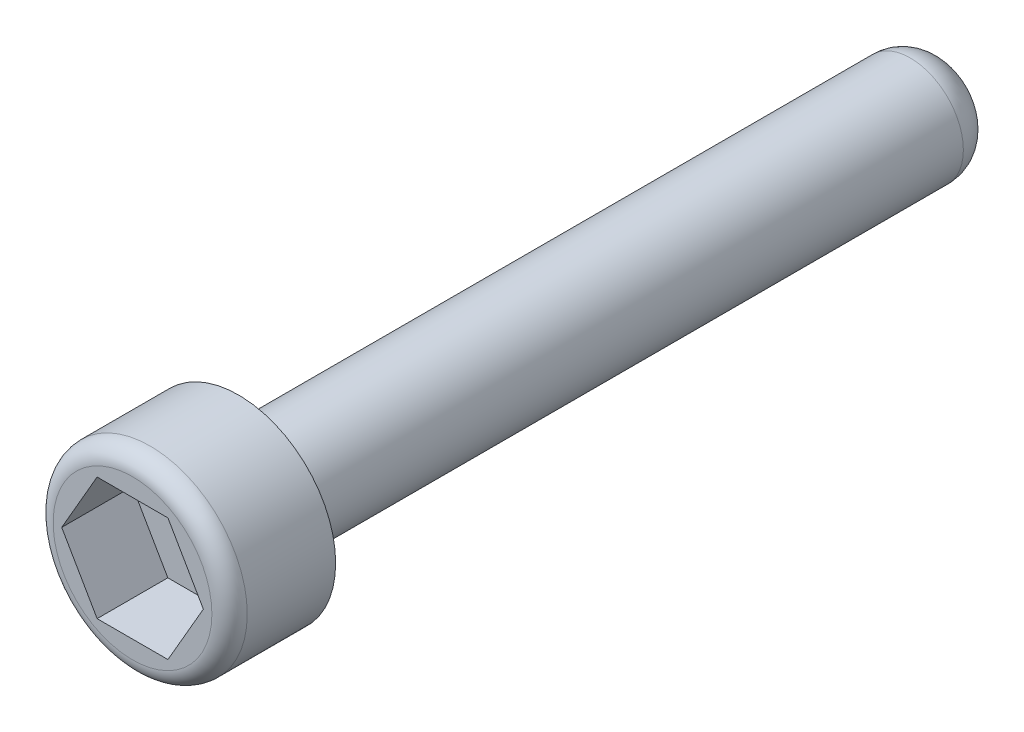
ISO-10303-21;
HEADER;
FILE_DESCRIPTION(('STEP AP214'),'2;1');
FILE_NAME('part.step','',(''),(''),'','','');
FILE_SCHEMA(('AUTOMOTIVE_DESIGN { 1 0 10303 214 1 1 1 1 }'));
ENDSEC;
DATA;
#1=APPLICATION_CONTEXT('core data for automotive mechanical design processes');
#2=APPLICATION_PROTOCOL_DEFINITION('international standard','automotive_design',2000,#1);
#3=PRODUCT_CONTEXT('',#1,'mechanical');
#4=PRODUCT('Part','Part','',(#3));
#5=PRODUCT_RELATED_PRODUCT_CATEGORY('part','',(#4));
#6=PRODUCT_DEFINITION_FORMATION('','',#4);
#7=PRODUCT_DEFINITION_CONTEXT('part definition',#1,'design');
#8=PRODUCT_DEFINITION('design','',#6,#7);
#9=PRODUCT_DEFINITION_SHAPE('','',#8);
#10=(LENGTH_UNIT() NAMED_UNIT(*) SI_UNIT(.MILLI.,.METRE.));
#11=(NAMED_UNIT(*) PLANE_ANGLE_UNIT() SI_UNIT($,.RADIAN.));
#12=(NAMED_UNIT(*) SI_UNIT($,.STERADIAN.) SOLID_ANGLE_UNIT());
#13=UNCERTAINTY_MEASURE_WITH_UNIT(LENGTH_MEASURE(1.E-05),#10,'distance_accuracy_value','');
#14=(GEOMETRIC_REPRESENTATION_CONTEXT(3) GLOBAL_UNCERTAINTY_ASSIGNED_CONTEXT((#13)) GLOBAL_UNIT_ASSIGNED_CONTEXT((#10,
#11,#12)) REPRESENTATION_CONTEXT('',''));
#15=CARTESIAN_POINT('',(0.,0.,0.));
#16=DIRECTION('',(0.,0.,1.));
#17=DIRECTION('',(1.,0.,0.));
#18=AXIS2_PLACEMENT_3D('',#15,#16,#17);
#19=CARTESIAN_POINT('',(0.,0.,-20.));
#20=DIRECTION('',(0.,0.,1.));
#21=DIRECTION('',(1.,0.,0.));
#22=AXIS2_PLACEMENT_3D('',#19,#20,#21);
#23=CYLINDRICAL_SURFACE('',#22,1.5);
#24=CARTESIAN_POINT('',(0.,0.,-19.));
#25=DIRECTION('',(0.,0.,1.));
#26=DIRECTION('',(1.,0.,0.));
#27=AXIS2_PLACEMENT_3D('',#24,#25,#26);
#28=CIRCLE('',#27,1.5);
#29=CARTESIAN_POINT('',(1.5,0.,-19.));
#30=VERTEX_POINT('',#29);
#31=EDGE_CURVE('E39',#30,#30,#28,.T.);
#32=ORIENTED_EDGE('',*,*,#31,.T.);
#33=EDGE_LOOP('',(#32));
#34=FACE_BOUND('',#33,.T.);
#35=CARTESIAN_POINT('',(0.,0.,0.));
#36=DIRECTION('',(0.,0.,1.));
#37=DIRECTION('',(1.,0.,0.));
#38=AXIS2_PLACEMENT_3D('',#35,#36,#37);
#39=CIRCLE('',#38,1.5);
#40=CARTESIAN_POINT('',(1.5,0.,0.));
#41=VERTEX_POINT('',#40);
#42=EDGE_CURVE('E141',#41,#41,#39,.T.);
#43=ORIENTED_EDGE('',*,*,#42,.F.);
#44=EDGE_LOOP('',(#43));
#45=FACE_BOUND('',#44,.T.);
#46=ADVANCED_FACE('F31',(#34,#45),#23,.T.);
#47=CARTESIAN_POINT('',(0.,0.,-20.));
#48=DIRECTION('',(0.,0.,1.));
#49=DIRECTION('',(1.,0.,0.));
#50=AXIS2_PLACEMENT_3D('',#47,#48,#49);
#51=PLANE('',#50);
#52=CARTESIAN_POINT('',(0.,0.,-20.));
#53=DIRECTION('',(0.,0.,1.));
#54=DIRECTION('',(1.,0.,0.));
#55=AXIS2_PLACEMENT_3D('',#52,#53,#54);
#56=CIRCLE('',#55,0.5);
#57=CARTESIAN_POINT('',(0.5,0.,-20.));
#58=VERTEX_POINT('',#57);
#59=EDGE_CURVE('E11',#58,#58,#56,.F.);
#60=ORIENTED_EDGE('',*,*,#59,.T.);
#61=EDGE_LOOP('',(#60));
#62=FACE_BOUND('',#61,.T.);
#63=ADVANCED_FACE('F163',(#62),#51,.F.);
#64=CARTESIAN_POINT('',(0.,0.,3.));
#65=DIRECTION('',(0.,0.,-1.));
#66=DIRECTION('',(-1.,0.,0.));
#67=AXIS2_PLACEMENT_3D('',#64,#65,#66);
#68=CYLINDRICAL_SURFACE('',#67,2.74501682478543);
#69=CARTESIAN_POINT('',(0.,0.,2.5));
#70=DIRECTION('',(0.,0.,1.));
#71=DIRECTION('',(1.,0.,0.));
#72=AXIS2_PLACEMENT_3D('',#69,#70,#71);
#73=CIRCLE('',#72,2.74501682478543);
#74=CARTESIAN_POINT('',(2.74501682478543,0.,2.5));
#75=VERTEX_POINT('',#74);
#76=EDGE_CURVE('E147',#75,#75,#73,.F.);
#77=ORIENTED_EDGE('',*,*,#76,.T.);
#78=EDGE_LOOP('',(#77));
#79=FACE_BOUND('',#78,.T.);
#80=CARTESIAN_POINT('',(0.,0.,0.));
#81=DIRECTION('',(0.,0.,1.));
#82=DIRECTION('',(1.,0.,0.));
#83=AXIS2_PLACEMENT_3D('',#80,#81,#82);
#84=CIRCLE('',#83,2.74501682478543);
#85=CARTESIAN_POINT('',(2.74501682478543,0.,0.));
#86=VERTEX_POINT('',#85);
#87=EDGE_CURVE('E133',#86,#86,#84,.T.);
#88=ORIENTED_EDGE('',*,*,#87,.T.);
#89=EDGE_LOOP('',(#88));
#90=FACE_BOUND('',#89,.T.);
#91=ADVANCED_FACE('F168',(#79,#90),#68,.T.);
#92=CARTESIAN_POINT('',(0.,0.,3.));
#93=DIRECTION('',(0.,0.,1.));
#94=DIRECTION('',(1.,0.,0.));
#95=AXIS2_PLACEMENT_3D('',#92,#93,#94);
#96=PLANE('',#95);
#97=CARTESIAN_POINT('',(0.,0.,3.));
#98=DIRECTION('',(0.,0.,1.));
#99=DIRECTION('',(1.,0.,0.));
#100=AXIS2_PLACEMENT_3D('',#97,#98,#99);
#101=CIRCLE('',#100,2.24501682478543);
#102=CARTESIAN_POINT('',(2.24501682478543,0.,3.));
#103=VERTEX_POINT('',#102);
#104=EDGE_CURVE('E144',#103,#103,#101,.T.);
#105=ORIENTED_EDGE('',*,*,#104,.T.);
#106=EDGE_LOOP('',(#105));
#107=FACE_BOUND('',#106,.T.);
#108=DIRECTION('',(-0.499999999999995,-0.866025403784442,0.));
#109=VECTOR('',#108,1.);
#110=CARTESIAN_POINT('',(-1.00156175032061,1.73475583847286,3.));
#111=LINE('',#110,#109);
#112=CARTESIAN_POINT('',(-1.00156175032061,1.73475583847286,3.));
#113=VERTEX_POINT('',#112);
#114=CARTESIAN_POINT('',(-2.00312350064117,0.,3.));
#115=VERTEX_POINT('',#114);
#116=EDGE_CURVE('E46',#113,#115,#111,.T.);
#117=ORIENTED_EDGE('',*,*,#116,.F.);
#118=DIRECTION('',(-1.,0.,0.));
#119=VECTOR('',#118,1.);
#120=CARTESIAN_POINT('',(1.00156175032057,1.73475583847288,3.));
#121=LINE('',#120,#119);
#122=CARTESIAN_POINT('',(1.00156175032057,1.73475583847288,3.));
#123=VERTEX_POINT('',#122);
#124=EDGE_CURVE('E129',#123,#113,#121,.T.);
#125=ORIENTED_EDGE('',*,*,#124,.F.);
#126=DIRECTION('',(-0.500000000000007,0.866025403784435,0.));
#127=VECTOR('',#126,1.);
#128=CARTESIAN_POINT('',(2.00312350064117,0.,3.));
#129=LINE('',#128,#127);
#130=CARTESIAN_POINT('',(2.00312350064117,0.,3.));
#131=VERTEX_POINT('',#130);
#132=EDGE_CURVE('E127',#131,#123,#129,.T.);
#133=ORIENTED_EDGE('',*,*,#132,.F.);
#134=DIRECTION('',(0.499999999999995,0.866025403784442,0.));
#135=VECTOR('',#134,1.);
#136=CARTESIAN_POINT('',(1.00156175032059,-1.73475583847286,3.));
#137=LINE('',#136,#135);
#138=CARTESIAN_POINT('',(1.00156175032059,-1.73475583847286,3.));
#139=VERTEX_POINT('',#138);
#140=EDGE_CURVE('E94',#139,#131,#137,.T.);
#141=ORIENTED_EDGE('',*,*,#140,.F.);
#142=DIRECTION('',(1.,0.,0.));
#143=VECTOR('',#142,1.);
#144=CARTESIAN_POINT('',(-1.00156175032058,-1.73475583847287,3.));
#145=LINE('',#144,#143);
#146=CARTESIAN_POINT('',(-1.00156175032058,-1.73475583847287,3.));
#147=VERTEX_POINT('',#146);
#148=EDGE_CURVE('E123',#147,#139,#145,.T.);
#149=ORIENTED_EDGE('',*,*,#148,.F.);
#150=DIRECTION('',(0.500000000000001,-0.866025403784438,0.));
#151=VECTOR('',#150,1.);
#152=CARTESIAN_POINT('',(-2.00312350064117,0.,3.));
#153=LINE('',#152,#151);
#154=EDGE_CURVE('E120',#115,#147,#153,.T.);
#155=ORIENTED_EDGE('',*,*,#154,.F.);
#156=EDGE_LOOP('',(#117,#125,#133,#141,#149,#155));
#157=FACE_BOUND('',#156,.T.);
#158=ADVANCED_FACE('F174',(#107,#157),#96,.T.);
#159=CARTESIAN_POINT('',(0.,0.,0.));
#160=DIRECTION('',(0.,0.,1.));
#161=DIRECTION('',(1.,0.,0.));
#162=AXIS2_PLACEMENT_3D('',#159,#160,#161);
#163=PLANE('',#162);
#164=ORIENTED_EDGE('',*,*,#42,.T.);
#165=EDGE_LOOP('',(#164));
#166=FACE_BOUND('',#165,.T.);
#167=ORIENTED_EDGE('',*,*,#87,.F.);
#168=EDGE_LOOP('',(#167));
#169=FACE_BOUND('',#168,.T.);
#170=ADVANCED_FACE('F176',(#166,#169),#163,.F.);
#171=CARTESIAN_POINT('',(-1.00156175032061,1.73475583847286,1.));
#172=DIRECTION('',(-0.866025403784442,0.499999999999995,0.));
#173=DIRECTION('',(-0.499999999999995,-0.866025403784442,0.));
#174=AXIS2_PLACEMENT_3D('',#171,#172,#173);
#175=PLANE('',#174);
#176=ORIENTED_EDGE('',*,*,#116,.T.);
#177=DIRECTION('',(0.,0.,1.));
#178=VECTOR('',#177,1.);
#179=CARTESIAN_POINT('',(-2.00312350064117,0.,1.));
#180=LINE('',#179,#178);
#181=CARTESIAN_POINT('',(-2.00312350064117,0.,1.));
#182=VERTEX_POINT('',#181);
#183=EDGE_CURVE('E76',#182,#115,#180,.T.);
#184=ORIENTED_EDGE('',*,*,#183,.F.);
#185=DIRECTION('',(-0.499999999999995,-0.866025403784442,0.));
#186=VECTOR('',#185,1.);
#187=CARTESIAN_POINT('',(-1.00156175032061,1.73475583847286,1.));
#188=LINE('',#187,#186);
#189=CARTESIAN_POINT('',(-1.00156175032061,1.73475583847286,1.));
#190=VERTEX_POINT('',#189);
#191=EDGE_CURVE('E131',#190,#182,#188,.T.);
#192=ORIENTED_EDGE('',*,*,#191,.F.);
#193=DIRECTION('',(0.,0.,1.));
#194=VECTOR('',#193,1.);
#195=CARTESIAN_POINT('',(-1.00156175032061,1.73475583847286,1.));
#196=LINE('',#195,#194);
#197=EDGE_CURVE('E54',#190,#113,#196,.T.);
#198=ORIENTED_EDGE('',*,*,#197,.T.);
#199=EDGE_LOOP('',(#176,#184,#192,#198));
#200=FACE_BOUND('',#199,.T.);
#201=ADVANCED_FACE('F179',(#200),#175,.F.);
#202=CARTESIAN_POINT('',(1.00156175032057,1.73475583847288,1.));
#203=DIRECTION('',(0.,1.,0.));
#204=DIRECTION('',(-1.,0.,0.));
#205=AXIS2_PLACEMENT_3D('',#202,#203,#204);
#206=PLANE('',#205);
#207=ORIENTED_EDGE('',*,*,#124,.T.);
#208=ORIENTED_EDGE('',*,*,#197,.F.);
#209=DIRECTION('',(-1.,0.,0.));
#210=VECTOR('',#209,1.);
#211=CARTESIAN_POINT('',(1.00156175032057,1.73475583847288,1.));
#212=LINE('',#211,#210);
#213=CARTESIAN_POINT('',(1.00156175032057,1.73475583847288,1.));
#214=VERTEX_POINT('',#213);
#215=EDGE_CURVE('E106',#214,#190,#212,.T.);
#216=ORIENTED_EDGE('',*,*,#215,.F.);
#217=DIRECTION('',(0.,0.,1.));
#218=VECTOR('',#217,1.);
#219=CARTESIAN_POINT('',(1.00156175032057,1.73475583847288,1.));
#220=LINE('',#219,#218);
#221=EDGE_CURVE('E98',#214,#123,#220,.T.);
#222=ORIENTED_EDGE('',*,*,#221,.T.);
#223=EDGE_LOOP('',(#207,#208,#216,#222));
#224=FACE_BOUND('',#223,.T.);
#225=ADVANCED_FACE('F186',(#224),#206,.F.);
#226=CARTESIAN_POINT('',(2.00312350064117,0.,1.));
#227=DIRECTION('',(0.866025403784435,0.500000000000007,0.));
#228=DIRECTION('',(-0.500000000000007,0.866025403784435,0.));
#229=AXIS2_PLACEMENT_3D('',#226,#227,#228);
#230=PLANE('',#229);
#231=ORIENTED_EDGE('',*,*,#132,.T.);
#232=ORIENTED_EDGE('',*,*,#221,.F.);
#233=DIRECTION('',(-0.500000000000007,0.866025403784435,0.));
#234=VECTOR('',#233,1.);
#235=CARTESIAN_POINT('',(2.00312350064117,0.,1.));
#236=LINE('',#235,#234);
#237=CARTESIAN_POINT('',(2.00312350064117,0.,1.));
#238=VERTEX_POINT('',#237);
#239=EDGE_CURVE('E102',#238,#214,#236,.T.);
#240=ORIENTED_EDGE('',*,*,#239,.F.);
#241=DIRECTION('',(0.,0.,1.));
#242=VECTOR('',#241,1.);
#243=CARTESIAN_POINT('',(2.00312350064117,0.,1.));
#244=LINE('',#243,#242);
#245=EDGE_CURVE('E87',#238,#131,#244,.T.);
#246=ORIENTED_EDGE('',*,*,#245,.T.);
#247=EDGE_LOOP('',(#231,#232,#240,#246));
#248=FACE_BOUND('',#247,.T.);
#249=ADVANCED_FACE('F103',(#248),#230,.F.);
#250=CARTESIAN_POINT('',(1.00156175032059,-1.73475583847286,1.));
#251=DIRECTION('',(0.866025403784442,-0.499999999999995,0.));
#252=DIRECTION('',(0.499999999999995,0.866025403784442,0.));
#253=AXIS2_PLACEMENT_3D('',#250,#251,#252);
#254=PLANE('',#253);
#255=ORIENTED_EDGE('',*,*,#140,.T.);
#256=ORIENTED_EDGE('',*,*,#245,.F.);
#257=DIRECTION('',(0.499999999999995,0.866025403784442,0.));
#258=VECTOR('',#257,1.);
#259=CARTESIAN_POINT('',(1.00156175032059,-1.73475583847286,1.));
#260=LINE('',#259,#258);
#261=CARTESIAN_POINT('',(1.00156175032059,-1.73475583847286,1.));
#262=VERTEX_POINT('',#261);
#263=EDGE_CURVE('E91',#262,#238,#260,.T.);
#264=ORIENTED_EDGE('',*,*,#263,.F.);
#265=DIRECTION('',(0.,0.,1.));
#266=VECTOR('',#265,1.);
#267=CARTESIAN_POINT('',(1.00156175032059,-1.73475583847286,1.));
#268=LINE('',#267,#266);
#269=EDGE_CURVE('E99',#262,#139,#268,.T.);
#270=ORIENTED_EDGE('',*,*,#269,.T.);
#271=EDGE_LOOP('',(#255,#256,#264,#270));
#272=FACE_BOUND('',#271,.T.);
#273=ADVANCED_FACE('F89',(#272),#254,.F.);
#274=CARTESIAN_POINT('',(-1.00156175032058,-1.73475583847287,1.));
#275=DIRECTION('',(0.,-1.,0.));
#276=DIRECTION('',(1.,0.,0.));
#277=AXIS2_PLACEMENT_3D('',#274,#275,#276);
#278=PLANE('',#277);
#279=ORIENTED_EDGE('',*,*,#148,.T.);
#280=ORIENTED_EDGE('',*,*,#269,.F.);
#281=DIRECTION('',(1.,0.,0.));
#282=VECTOR('',#281,1.);
#283=CARTESIAN_POINT('',(-1.00156175032058,-1.73475583847287,1.));
#284=LINE('',#283,#282);
#285=CARTESIAN_POINT('',(-1.00156175032058,-1.73475583847287,1.));
#286=VERTEX_POINT('',#285);
#287=EDGE_CURVE('E112',#286,#262,#284,.T.);
#288=ORIENTED_EDGE('',*,*,#287,.F.);
#289=DIRECTION('',(0.,0.,1.));
#290=VECTOR('',#289,1.);
#291=CARTESIAN_POINT('',(-1.00156175032058,-1.73475583847287,1.));
#292=LINE('',#291,#290);
#293=EDGE_CURVE('E136',#286,#147,#292,.T.);
#294=ORIENTED_EDGE('',*,*,#293,.T.);
#295=EDGE_LOOP('',(#279,#280,#288,#294));
#296=FACE_BOUND('',#295,.T.);
#297=ADVANCED_FACE('F190',(#296),#278,.F.);
#298=CARTESIAN_POINT('',(-2.00312350064117,0.,1.));
#299=DIRECTION('',(-0.866025403784438,-0.500000000000001,0.));
#300=DIRECTION('',(0.500000000000001,-0.866025403784438,0.));
#301=AXIS2_PLACEMENT_3D('',#298,#299,#300);
#302=PLANE('',#301);
#303=ORIENTED_EDGE('',*,*,#154,.T.);
#304=ORIENTED_EDGE('',*,*,#293,.F.);
#305=DIRECTION('',(0.500000000000001,-0.866025403784438,0.));
#306=VECTOR('',#305,1.);
#307=CARTESIAN_POINT('',(-2.00312350064117,0.,1.));
#308=LINE('',#307,#306);
#309=EDGE_CURVE('E114',#182,#286,#308,.T.);
#310=ORIENTED_EDGE('',*,*,#309,.F.);
#311=ORIENTED_EDGE('',*,*,#183,.T.);
#312=EDGE_LOOP('',(#303,#304,#310,#311));
#313=FACE_BOUND('',#312,.T.);
#314=ADVANCED_FACE('F187',(#313),#302,.F.);
#315=CARTESIAN_POINT('',(0.,3.46951167694573,1.));
#316=DIRECTION('',(0.,0.,-1.));
#317=DIRECTION('',(-1.,0.,0.));
#318=AXIS2_PLACEMENT_3D('',#315,#316,#317);
#319=PLANE('',#318);
#320=ORIENTED_EDGE('',*,*,#191,.T.);
#321=ORIENTED_EDGE('',*,*,#309,.T.);
#322=ORIENTED_EDGE('',*,*,#287,.T.);
#323=ORIENTED_EDGE('',*,*,#263,.T.);
#324=ORIENTED_EDGE('',*,*,#239,.T.);
#325=ORIENTED_EDGE('',*,*,#215,.T.);
#326=EDGE_LOOP('',(#320,#321,#322,#323,#324,#325));
#327=FACE_BOUND('',#326,.T.);
#328=ADVANCED_FACE('F109',(#327),#319,.F.);
#329=CARTESIAN_POINT('',(0.,0.,2.5));
#330=DIRECTION('',(0.,0.,1.));
#331=DIRECTION('',(1.,0.,0.));
#332=AXIS2_PLACEMENT_3D('',#329,#330,#331);
#333=TOROIDAL_SURFACE('',#332,2.24501682478543,0.5);
#334=ORIENTED_EDGE('',*,*,#76,.F.);
#335=EDGE_LOOP('',(#334));
#336=FACE_BOUND('',#335,.T.);
#337=ORIENTED_EDGE('',*,*,#104,.F.);
#338=EDGE_LOOP('',(#337));
#339=FACE_BOUND('',#338,.T.);
#340=ADVANCED_FACE('F155',(#336,#339),#333,.T.);
#341=CARTESIAN_POINT('',(0.,0.,-19.));
#342=DIRECTION('',(0.,0.,1.));
#343=DIRECTION('',(1.,0.,0.));
#344=AXIS2_PLACEMENT_3D('',#341,#342,#343);
#345=DEGENERATE_TOROIDAL_SURFACE('',#344,0.5,1.,.T.);
#346=ORIENTED_EDGE('',*,*,#59,.F.);
#347=EDGE_LOOP('',(#346));
#348=FACE_BOUND('',#347,.T.);
#349=ORIENTED_EDGE('',*,*,#31,.F.);
#350=EDGE_LOOP('',(#349));
#351=FACE_BOUND('',#350,.T.);
#352=ADVANCED_FACE('F33',(#348,#351),#345,.T.);
#353=CLOSED_SHELL('',(#46,#63,#91,#158,#170,#201,#225,#249,#273,#297,#314,#328,#340,#352));
#354=MANIFOLD_SOLID_BREP('B2',#353);
#355=ADVANCED_BREP_SHAPE_REPRESENTATION('',(#18,#354),#14);
#356=SHAPE_DEFINITION_REPRESENTATION(#9,#355);
ENDSEC;
END-ISO-10303-21;
